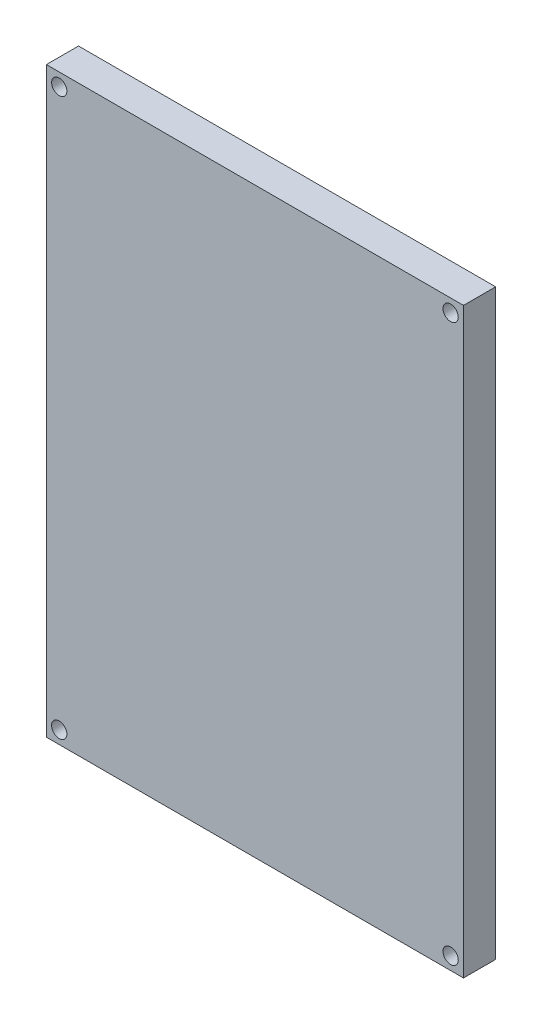
ISO-10303-21;
HEADER;
FILE_DESCRIPTION(('STEP AP214'),'2;1');
FILE_NAME('part.step','',(''),(''),'','','');
FILE_SCHEMA(('AUTOMOTIVE_DESIGN { 1 0 10303 214 1 1 1 1 }'));
ENDSEC;
DATA;
#1=APPLICATION_CONTEXT('core data for automotive mechanical design processes');
#2=APPLICATION_PROTOCOL_DEFINITION('international standard','automotive_design',2000,#1);
#3=PRODUCT_CONTEXT('',#1,'mechanical');
#4=PRODUCT('Part','Part','',(#3));
#5=PRODUCT_RELATED_PRODUCT_CATEGORY('part','',(#4));
#6=PRODUCT_DEFINITION_FORMATION('','',#4);
#7=PRODUCT_DEFINITION_CONTEXT('part definition',#1,'design');
#8=PRODUCT_DEFINITION('design','',#6,#7);
#9=PRODUCT_DEFINITION_SHAPE('','',#8);
#10=(LENGTH_UNIT() NAMED_UNIT(*) SI_UNIT(.MILLI.,.METRE.));
#11=(NAMED_UNIT(*) PLANE_ANGLE_UNIT() SI_UNIT($,.RADIAN.));
#12=(NAMED_UNIT(*) SI_UNIT($,.STERADIAN.) SOLID_ANGLE_UNIT());
#13=UNCERTAINTY_MEASURE_WITH_UNIT(LENGTH_MEASURE(1.E-05),#10,'distance_accuracy_value','');
#14=(GEOMETRIC_REPRESENTATION_CONTEXT(3) GLOBAL_UNCERTAINTY_ASSIGNED_CONTEXT((#13)) GLOBAL_UNIT_ASSIGNED_CONTEXT((#10,
#11,#12)) REPRESENTATION_CONTEXT('',''));
#15=CARTESIAN_POINT('',(0.,0.,0.));
#16=DIRECTION('',(0.,0.,1.));
#17=DIRECTION('',(1.,0.,0.));
#18=AXIS2_PLACEMENT_3D('',#15,#16,#17);
#19=CARTESIAN_POINT('',(0.,0.,0.));
#20=DIRECTION('',(0.,0.,-1.));
#21=DIRECTION('',(-1.,0.,0.));
#22=AXIS2_PLACEMENT_3D('',#19,#20,#21);
#23=PLANE('',#22);
#24=CARTESIAN_POINT('',(0.8,0.8,0.));
#25=DIRECTION('',(0.,0.,1.));
#26=DIRECTION('',(1.,0.,0.));
#27=AXIS2_PLACEMENT_3D('',#24,#25,#26);
#28=CIRCLE('',#27,0.475);
#29=CARTESIAN_POINT('',(1.275,0.8,0.));
#30=VERTEX_POINT('',#29);
#31=EDGE_CURVE('E137',#30,#30,#28,.T.);
#32=ORIENTED_EDGE('',*,*,#31,.T.);
#33=EDGE_LOOP('',(#32));
#34=FACE_BOUND('',#33,.T.);
#35=CARTESIAN_POINT('',(25.15,0.799999999999998,0.));
#36=DIRECTION('',(0.,0.,1.));
#37=DIRECTION('',(1.,0.,0.));
#38=AXIS2_PLACEMENT_3D('',#35,#36,#37);
#39=CIRCLE('',#38,0.475);
#40=CARTESIAN_POINT('',(25.625,0.799999999999998,0.));
#41=VERTEX_POINT('',#40);
#42=EDGE_CURVE('E131',#41,#41,#39,.T.);
#43=ORIENTED_EDGE('',*,*,#42,.T.);
#44=EDGE_LOOP('',(#43));
#45=FACE_BOUND('',#44,.T.);
#46=CARTESIAN_POINT('',(25.15,35.44,0.));
#47=DIRECTION('',(0.,0.,1.));
#48=DIRECTION('',(1.,0.,0.));
#49=AXIS2_PLACEMENT_3D('',#46,#47,#48);
#50=CIRCLE('',#49,0.475);
#51=CARTESIAN_POINT('',(25.625,35.44,0.));
#52=VERTEX_POINT('',#51);
#53=EDGE_CURVE('E125',#52,#52,#50,.T.);
#54=ORIENTED_EDGE('',*,*,#53,.T.);
#55=EDGE_LOOP('',(#54));
#56=FACE_BOUND('',#55,.T.);
#57=DIRECTION('',(0.,-1.,0.));
#58=VECTOR('',#57,1.);
#59=CARTESIAN_POINT('',(0.,0.,0.));
#60=LINE('',#59,#58);
#61=CARTESIAN_POINT('',(0.,36.24,0.));
#62=VERTEX_POINT('',#61);
#63=CARTESIAN_POINT('',(0.,0.,0.));
#64=VERTEX_POINT('',#63);
#65=EDGE_CURVE('E106',#62,#64,#60,.T.);
#66=ORIENTED_EDGE('',*,*,#65,.F.);
#67=DIRECTION('',(-1.,0.,0.));
#68=VECTOR('',#67,1.);
#69=CARTESIAN_POINT('',(0.,36.24,0.));
#70=LINE('',#69,#68);
#71=CARTESIAN_POINT('',(25.95,36.24,0.));
#72=VERTEX_POINT('',#71);
#73=EDGE_CURVE('E82',#72,#62,#70,.T.);
#74=ORIENTED_EDGE('',*,*,#73,.F.);
#75=DIRECTION('',(0.,1.,0.));
#76=VECTOR('',#75,1.);
#77=CARTESIAN_POINT('',(25.95,0.,0.));
#78=LINE('',#77,#76);
#79=CARTESIAN_POINT('',(25.95,0.,0.));
#80=VERTEX_POINT('',#79);
#81=EDGE_CURVE('E76',#80,#72,#78,.T.);
#82=ORIENTED_EDGE('',*,*,#81,.F.);
#83=DIRECTION('',(1.,0.,0.));
#84=VECTOR('',#83,1.);
#85=CARTESIAN_POINT('',(0.,0.,0.));
#86=LINE('',#85,#84);
#87=EDGE_CURVE('E98',#64,#80,#86,.T.);
#88=ORIENTED_EDGE('',*,*,#87,.F.);
#89=EDGE_LOOP('',(#66,#74,#82,#88));
#90=FACE_BOUND('',#89,.T.);
#91=CARTESIAN_POINT('',(0.799999999999998,35.44,0.));
#92=DIRECTION('',(0.,0.,1.));
#93=DIRECTION('',(1.,0.,0.));
#94=AXIS2_PLACEMENT_3D('',#91,#92,#93);
#95=CIRCLE('',#94,0.474999999999999);
#96=CARTESIAN_POINT('',(1.275,35.44,0.));
#97=VERTEX_POINT('',#96);
#98=EDGE_CURVE('E109',#97,#97,#95,.T.);
#99=ORIENTED_EDGE('',*,*,#98,.T.);
#100=EDGE_LOOP('',(#99));
#101=FACE_BOUND('',#100,.T.);
#102=ADVANCED_FACE('F42',(#34,#45,#56,#90,#101),#23,.T.);
#103=CARTESIAN_POINT('',(0.,0.,2.));
#104=DIRECTION('',(1.,0.,0.));
#105=DIRECTION('',(0.,0.,-1.));
#106=AXIS2_PLACEMENT_3D('',#103,#104,#105);
#107=PLANE('',#106);
#108=ORIENTED_EDGE('',*,*,#65,.T.);
#109=DIRECTION('',(0.,0.,-1.));
#110=VECTOR('',#109,1.);
#111=CARTESIAN_POINT('',(0.,0.,2.));
#112=LINE('',#111,#110);
#113=CARTESIAN_POINT('',(0.,0.,2.));
#114=VERTEX_POINT('',#113);
#115=EDGE_CURVE('E11',#114,#64,#112,.T.);
#116=ORIENTED_EDGE('',*,*,#115,.F.);
#117=DIRECTION('',(0.,-1.,0.));
#118=VECTOR('',#117,1.);
#119=CARTESIAN_POINT('',(0.,0.,2.));
#120=LINE('',#119,#118);
#121=CARTESIAN_POINT('',(0.,36.24,2.));
#122=VERTEX_POINT('',#121);
#123=EDGE_CURVE('E94',#122,#114,#120,.T.);
#124=ORIENTED_EDGE('',*,*,#123,.F.);
#125=DIRECTION('',(0.,0.,-1.));
#126=VECTOR('',#125,1.);
#127=CARTESIAN_POINT('',(0.,36.24,2.));
#128=LINE('',#127,#126);
#129=EDGE_CURVE('E102',#122,#62,#128,.T.);
#130=ORIENTED_EDGE('',*,*,#129,.T.);
#131=EDGE_LOOP('',(#108,#116,#124,#130));
#132=FACE_BOUND('',#131,.T.);
#133=ADVANCED_FACE('F44',(#132),#107,.F.);
#134=CARTESIAN_POINT('',(0.,0.,2.));
#135=DIRECTION('',(0.,1.,0.));
#136=DIRECTION('',(0.,0.,1.));
#137=AXIS2_PLACEMENT_3D('',#134,#135,#136);
#138=PLANE('',#137);
#139=ORIENTED_EDGE('',*,*,#87,.T.);
#140=DIRECTION('',(0.,0.,-1.));
#141=VECTOR('',#140,1.);
#142=CARTESIAN_POINT('',(25.95,0.,2.));
#143=LINE('',#142,#141);
#144=CARTESIAN_POINT('',(25.95,0.,2.));
#145=VERTEX_POINT('',#144);
#146=EDGE_CURVE('E51',#145,#80,#143,.T.);
#147=ORIENTED_EDGE('',*,*,#146,.F.);
#148=DIRECTION('',(1.,0.,0.));
#149=VECTOR('',#148,1.);
#150=CARTESIAN_POINT('',(0.,0.,2.));
#151=LINE('',#150,#149);
#152=EDGE_CURVE('E89',#114,#145,#151,.T.);
#153=ORIENTED_EDGE('',*,*,#152,.F.);
#154=ORIENTED_EDGE('',*,*,#115,.T.);
#155=EDGE_LOOP('',(#139,#147,#153,#154));
#156=FACE_BOUND('',#155,.T.);
#157=ADVANCED_FACE('F97',(#156),#138,.F.);
#158=CARTESIAN_POINT('',(25.95,0.,2.));
#159=DIRECTION('',(-1.,0.,0.));
#160=DIRECTION('',(0.,0.,1.));
#161=AXIS2_PLACEMENT_3D('',#158,#159,#160);
#162=PLANE('',#161);
#163=ORIENTED_EDGE('',*,*,#81,.T.);
#164=DIRECTION('',(0.,0.,-1.));
#165=VECTOR('',#164,1.);
#166=CARTESIAN_POINT('',(25.95,36.24,2.));
#167=LINE('',#166,#165);
#168=CARTESIAN_POINT('',(25.95,36.24,2.));
#169=VERTEX_POINT('',#168);
#170=EDGE_CURVE('E99',#169,#72,#167,.T.);
#171=ORIENTED_EDGE('',*,*,#170,.F.);
#172=DIRECTION('',(0.,1.,0.));
#173=VECTOR('',#172,1.);
#174=CARTESIAN_POINT('',(25.95,0.,2.));
#175=LINE('',#174,#173);
#176=EDGE_CURVE('E92',#145,#169,#175,.T.);
#177=ORIENTED_EDGE('',*,*,#176,.F.);
#178=ORIENTED_EDGE('',*,*,#146,.T.);
#179=EDGE_LOOP('',(#163,#171,#177,#178));
#180=FACE_BOUND('',#179,.T.);
#181=ADVANCED_FACE('F100',(#180),#162,.F.);
#182=CARTESIAN_POINT('',(0.,36.24,2.));
#183=DIRECTION('',(0.,-1.,0.));
#184=DIRECTION('',(0.,0.,-1.));
#185=AXIS2_PLACEMENT_3D('',#182,#183,#184);
#186=PLANE('',#185);
#187=ORIENTED_EDGE('',*,*,#73,.T.);
#188=ORIENTED_EDGE('',*,*,#129,.F.);
#189=DIRECTION('',(-1.,0.,0.));
#190=VECTOR('',#189,1.);
#191=CARTESIAN_POINT('',(0.,36.24,2.));
#192=LINE('',#191,#190);
#193=EDGE_CURVE('E59',#169,#122,#192,.T.);
#194=ORIENTED_EDGE('',*,*,#193,.F.);
#195=ORIENTED_EDGE('',*,*,#170,.T.);
#196=EDGE_LOOP('',(#187,#188,#194,#195));
#197=FACE_BOUND('',#196,.T.);
#198=ADVANCED_FACE('F114',(#197),#186,.F.);
#199=CARTESIAN_POINT('',(0.,0.,2.));
#200=DIRECTION('',(0.,0.,-1.));
#201=DIRECTION('',(-1.,0.,0.));
#202=AXIS2_PLACEMENT_3D('',#199,#200,#201);
#203=PLANE('',#202);
#204=CARTESIAN_POINT('',(0.8,0.8,2.));
#205=DIRECTION('',(0.,0.,1.));
#206=DIRECTION('',(1.,0.,0.));
#207=AXIS2_PLACEMENT_3D('',#204,#205,#206);
#208=CIRCLE('',#207,0.474999999999988);
#209=CARTESIAN_POINT('',(1.27499999999999,0.8,2.));
#210=VERTEX_POINT('',#209);
#211=EDGE_CURVE('E140',#210,#210,#208,.T.);
#212=ORIENTED_EDGE('',*,*,#211,.F.);
#213=EDGE_LOOP('',(#212));
#214=FACE_BOUND('',#213,.T.);
#215=CARTESIAN_POINT('',(25.15,0.799999999999998,2.));
#216=DIRECTION('',(0.,0.,1.));
#217=DIRECTION('',(1.,0.,0.));
#218=AXIS2_PLACEMENT_3D('',#215,#216,#217);
#219=CIRCLE('',#218,0.474999999999989);
#220=CARTESIAN_POINT('',(25.625,0.799999999999998,2.));
#221=VERTEX_POINT('',#220);
#222=EDGE_CURVE('E134',#221,#221,#219,.T.);
#223=ORIENTED_EDGE('',*,*,#222,.F.);
#224=EDGE_LOOP('',(#223));
#225=FACE_BOUND('',#224,.T.);
#226=CARTESIAN_POINT('',(25.15,35.44,2.));
#227=DIRECTION('',(0.,0.,1.));
#228=DIRECTION('',(1.,0.,0.));
#229=AXIS2_PLACEMENT_3D('',#226,#227,#228);
#230=CIRCLE('',#229,0.474999999999989);
#231=CARTESIAN_POINT('',(25.625,35.44,2.));
#232=VERTEX_POINT('',#231);
#233=EDGE_CURVE('E128',#232,#232,#230,.T.);
#234=ORIENTED_EDGE('',*,*,#233,.F.);
#235=EDGE_LOOP('',(#234));
#236=FACE_BOUND('',#235,.T.);
#237=CARTESIAN_POINT('',(0.799999999999998,35.44,2.));
#238=DIRECTION('',(0.,0.,1.));
#239=DIRECTION('',(1.,0.,0.));
#240=AXIS2_PLACEMENT_3D('',#237,#238,#239);
#241=CIRCLE('',#240,0.474999999999988);
#242=CARTESIAN_POINT('',(1.27499999999999,35.44,2.));
#243=VERTEX_POINT('',#242);
#244=EDGE_CURVE('E122',#243,#243,#241,.T.);
#245=ORIENTED_EDGE('',*,*,#244,.F.);
#246=EDGE_LOOP('',(#245));
#247=FACE_BOUND('',#246,.T.);
#248=ORIENTED_EDGE('',*,*,#123,.T.);
#249=ORIENTED_EDGE('',*,*,#152,.T.);
#250=ORIENTED_EDGE('',*,*,#176,.T.);
#251=ORIENTED_EDGE('',*,*,#193,.T.);
#252=EDGE_LOOP('',(#248,#249,#250,#251));
#253=FACE_BOUND('',#252,.T.);
#254=ADVANCED_FACE('F90',(#214,#225,#236,#247,#253),#203,.F.);
#255=CARTESIAN_POINT('',(0.799999999999998,35.44,2.));
#256=DIRECTION('',(0.,0.,1.));
#257=DIRECTION('',(1.,0.,0.));
#258=AXIS2_PLACEMENT_3D('',#255,#256,#257);
#259=CYLINDRICAL_SURFACE('',#258,0.474999999999994);
#260=ORIENTED_EDGE('',*,*,#98,.F.);
#261=EDGE_LOOP('',(#260));
#262=FACE_BOUND('',#261,.T.);
#263=ORIENTED_EDGE('',*,*,#244,.T.);
#264=EDGE_LOOP('',(#263));
#265=FACE_BOUND('',#264,.T.);
#266=ADVANCED_FACE('F148',(#262,#265),#259,.F.);
#267=CARTESIAN_POINT('',(25.15,35.44,2.));
#268=DIRECTION('',(0.,0.,1.));
#269=DIRECTION('',(1.,0.,0.));
#270=AXIS2_PLACEMENT_3D('',#267,#268,#269);
#271=CYLINDRICAL_SURFACE('',#270,0.474999999999995);
#272=ORIENTED_EDGE('',*,*,#53,.F.);
#273=EDGE_LOOP('',(#272));
#274=FACE_BOUND('',#273,.T.);
#275=ORIENTED_EDGE('',*,*,#233,.T.);
#276=EDGE_LOOP('',(#275));
#277=FACE_BOUND('',#276,.T.);
#278=ADVANCED_FACE('F157',(#274,#277),#271,.F.);
#279=CARTESIAN_POINT('',(25.15,0.799999999999998,2.));
#280=DIRECTION('',(0.,0.,1.));
#281=DIRECTION('',(1.,0.,0.));
#282=AXIS2_PLACEMENT_3D('',#279,#280,#281);
#283=CYLINDRICAL_SURFACE('',#282,0.474999999999995);
#284=ORIENTED_EDGE('',*,*,#42,.F.);
#285=EDGE_LOOP('',(#284));
#286=FACE_BOUND('',#285,.T.);
#287=ORIENTED_EDGE('',*,*,#222,.T.);
#288=EDGE_LOOP('',(#287));
#289=FACE_BOUND('',#288,.T.);
#290=ADVANCED_FACE('F163',(#286,#289),#283,.F.);
#291=CARTESIAN_POINT('',(0.8,0.8,2.));
#292=DIRECTION('',(0.,0.,1.));
#293=DIRECTION('',(1.,0.,0.));
#294=AXIS2_PLACEMENT_3D('',#291,#292,#293);
#295=CYLINDRICAL_SURFACE('',#294,0.474999999999994);
#296=ORIENTED_EDGE('',*,*,#31,.F.);
#297=EDGE_LOOP('',(#296));
#298=FACE_BOUND('',#297,.T.);
#299=ORIENTED_EDGE('',*,*,#211,.T.);
#300=EDGE_LOOP('',(#299));
#301=FACE_BOUND('',#300,.T.);
#302=ADVANCED_FACE('F144',(#298,#301),#295,.F.);
#303=CLOSED_SHELL('',(#102,#133,#157,#181,#198,#254,#266,#278,#290,#302));
#304=MANIFOLD_SOLID_BREP('B2',#303);
#305=ADVANCED_BREP_SHAPE_REPRESENTATION('',(#18,#304),#14);
#306=SHAPE_DEFINITION_REPRESENTATION(#9,#305);
ENDSEC;
END-ISO-10303-21;
